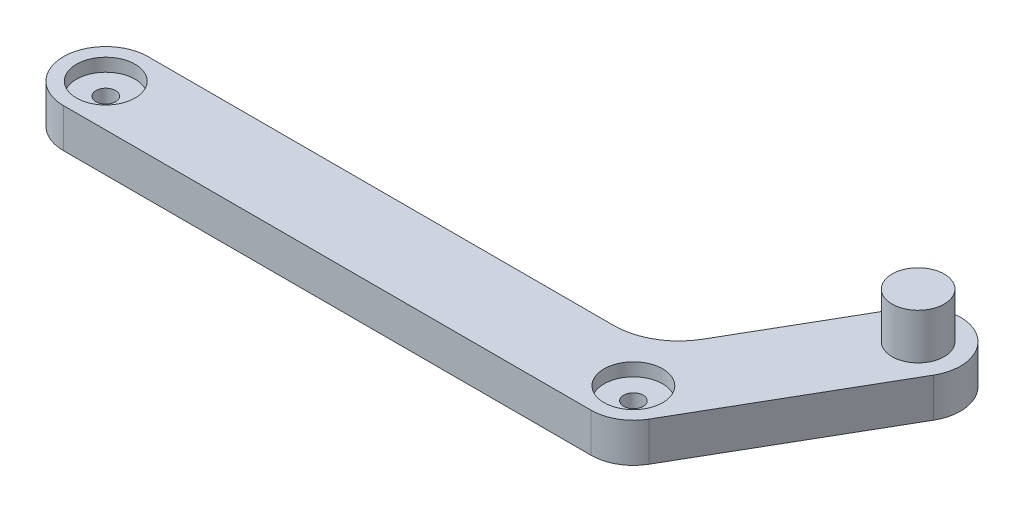
ISO-10303-21;
HEADER;
FILE_DESCRIPTION(('STEP AP214'),'2;1');
FILE_NAME('part.step','',(''),(''),'','','');
FILE_SCHEMA(('AUTOMOTIVE_DESIGN { 1 0 10303 214 1 1 1 1 }'));
ENDSEC;
DATA;
#1=APPLICATION_CONTEXT('core data for automotive mechanical design processes');
#2=APPLICATION_PROTOCOL_DEFINITION('international standard','automotive_design',2000,#1);
#3=PRODUCT_CONTEXT('',#1,'mechanical');
#4=PRODUCT('Part','Part','',(#3));
#5=PRODUCT_RELATED_PRODUCT_CATEGORY('part','',(#4));
#6=PRODUCT_DEFINITION_FORMATION('','',#4);
#7=PRODUCT_DEFINITION_CONTEXT('part definition',#1,'design');
#8=PRODUCT_DEFINITION('design','',#6,#7);
#9=PRODUCT_DEFINITION_SHAPE('','',#8);
#10=(LENGTH_UNIT() NAMED_UNIT(*) SI_UNIT(.MILLI.,.METRE.));
#11=(NAMED_UNIT(*) PLANE_ANGLE_UNIT() SI_UNIT($,.RADIAN.));
#12=(NAMED_UNIT(*) SI_UNIT($,.STERADIAN.) SOLID_ANGLE_UNIT());
#13=UNCERTAINTY_MEASURE_WITH_UNIT(LENGTH_MEASURE(1.E-05),#10,'distance_accuracy_value','');
#14=(GEOMETRIC_REPRESENTATION_CONTEXT(3) GLOBAL_UNCERTAINTY_ASSIGNED_CONTEXT((#13)) GLOBAL_UNIT_ASSIGNED_CONTEXT((#10,
#11,#12)) REPRESENTATION_CONTEXT('',''));
#15=CARTESIAN_POINT('',(0.,0.,0.));
#16=DIRECTION('',(0.,0.,1.));
#17=DIRECTION('',(1.,0.,0.));
#18=AXIS2_PLACEMENT_3D('',#15,#16,#17);
#19=CARTESIAN_POINT('',(0.,6.,0.));
#20=DIRECTION('',(0.,-1.,0.));
#21=DIRECTION('',(0.,0.,-1.));
#22=AXIS2_PLACEMENT_3D('',#19,#20,#21);
#23=CYLINDRICAL_SURFACE('',#22,1.5);
#24=CARTESIAN_POINT('',(0.,0.,0.));
#25=DIRECTION('',(0.,1.,0.));
#26=DIRECTION('',(0.,0.,1.));
#27=AXIS2_PLACEMENT_3D('',#24,#25,#26);
#28=CIRCLE('',#27,1.5);
#29=CARTESIAN_POINT('',(0.,0.,1.5));
#30=VERTEX_POINT('',#29);
#31=EDGE_CURVE('E152',#30,#30,#28,.T.);
#32=ORIENTED_EDGE('',*,*,#31,.F.);
#33=EDGE_LOOP('',(#32));
#34=FACE_BOUND('',#33,.T.);
#35=CARTESIAN_POINT('',(0.,4.,0.));
#36=DIRECTION('',(0.,1.,0.));
#37=DIRECTION('',(0.,0.,1.));
#38=AXIS2_PLACEMENT_3D('',#35,#36,#37);
#39=CIRCLE('',#38,1.5);
#40=CARTESIAN_POINT('',(0.,4.,1.5));
#41=VERTEX_POINT('',#40);
#42=EDGE_CURVE('E47',#41,#41,#39,.T.);
#43=ORIENTED_EDGE('',*,*,#42,.T.);
#44=EDGE_LOOP('',(#43));
#45=FACE_BOUND('',#44,.T.);
#46=ADVANCED_FACE('F43',(#34,#45),#23,.F.);
#47=CARTESIAN_POINT('',(81.,6.,0.));
#48=DIRECTION('',(0.,-1.,0.));
#49=DIRECTION('',(0.,0.,-1.));
#50=AXIS2_PLACEMENT_3D('',#47,#48,#49);
#51=CYLINDRICAL_SURFACE('',#50,1.5);
#52=CARTESIAN_POINT('',(81.,0.,0.));
#53=DIRECTION('',(0.,1.,0.));
#54=DIRECTION('',(0.,0.,1.));
#55=AXIS2_PLACEMENT_3D('',#52,#53,#54);
#56=CIRCLE('',#55,1.5);
#57=CARTESIAN_POINT('',(81.,0.,1.5));
#58=VERTEX_POINT('',#57);
#59=EDGE_CURVE('E196',#58,#58,#56,.T.);
#60=ORIENTED_EDGE('',*,*,#59,.F.);
#61=EDGE_LOOP('',(#60));
#62=FACE_BOUND('',#61,.T.);
#63=CARTESIAN_POINT('',(81.,4.,0.));
#64=DIRECTION('',(0.,1.,0.));
#65=DIRECTION('',(0.,0.,1.));
#66=AXIS2_PLACEMENT_3D('',#63,#64,#65);
#67=CIRCLE('',#66,1.5);
#68=CARTESIAN_POINT('',(81.,4.,1.5));
#69=VERTEX_POINT('',#68);
#70=EDGE_CURVE('E187',#69,#69,#67,.T.);
#71=ORIENTED_EDGE('',*,*,#70,.T.);
#72=EDGE_LOOP('',(#71));
#73=FACE_BOUND('',#72,.T.);
#74=ADVANCED_FACE('F266',(#62,#73),#51,.F.);
#75=CARTESIAN_POINT('',(0.,6.,0.));
#76=DIRECTION('',(0.,1.,0.));
#77=DIRECTION('',(0.,0.,1.));
#78=AXIS2_PLACEMENT_3D('',#75,#76,#77);
#79=PLANE('',#78);
#80=CARTESIAN_POINT('',(96.9999999999999,6.,-27.7128129211021));
#81=DIRECTION('',(0.,1.,0.));
#82=DIRECTION('',(0.,0.,1.));
#83=AXIS2_PLACEMENT_3D('',#80,#81,#82);
#84=CIRCLE('',#83,4.00000000000001);
#85=CARTESIAN_POINT('',(96.9999999999999,6.,-23.7128129211021));
#86=VERTEX_POINT('',#85);
#87=EDGE_CURVE('E207',#86,#86,#84,.T.);
#88=ORIENTED_EDGE('',*,*,#87,.F.);
#89=EDGE_LOOP('',(#88));
#90=FACE_BOUND('',#89,.T.);
#91=CARTESIAN_POINT('',(81.,6.,0.));
#92=DIRECTION('',(0.,1.,0.));
#93=DIRECTION('',(0.,0.,1.));
#94=AXIS2_PLACEMENT_3D('',#91,#92,#93);
#95=CIRCLE('',#94,4.49999999999999);
#96=CARTESIAN_POINT('',(81.,6.,4.49999999999999));
#97=VERTEX_POINT('',#96);
#98=EDGE_CURVE('E198',#97,#97,#95,.T.);
#99=ORIENTED_EDGE('',*,*,#98,.F.);
#100=EDGE_LOOP('',(#99));
#101=FACE_BOUND('',#100,.T.);
#102=CARTESIAN_POINT('',(0.,6.,0.));
#103=DIRECTION('',(0.,1.,0.));
#104=DIRECTION('',(0.,0.,1.));
#105=AXIS2_PLACEMENT_3D('',#102,#103,#104);
#106=CIRCLE('',#105,4.5);
#107=CARTESIAN_POINT('',(0.,6.,4.5));
#108=VERTEX_POINT('',#107);
#109=EDGE_CURVE('E204',#108,#108,#106,.T.);
#110=ORIENTED_EDGE('',*,*,#109,.F.);
#111=EDGE_LOOP('',(#110));
#112=FACE_BOUND('',#111,.T.);
#113=CARTESIAN_POINT('',(0.,6.,0.));
#114=DIRECTION('',(0.,1.,0.));
#115=DIRECTION('',(0.,0.,1.));
#116=AXIS2_PLACEMENT_3D('',#113,#114,#115);
#117=CIRCLE('',#116,6.5);
#118=CARTESIAN_POINT('',(0.,6.,-6.5));
#119=VERTEX_POINT('',#118);
#120=CARTESIAN_POINT('',(0.,6.,6.5));
#121=VERTEX_POINT('',#120);
#122=EDGE_CURVE('E170',#119,#121,#117,.T.);
#123=ORIENTED_EDGE('',*,*,#122,.T.);
#124=DIRECTION('',(1.,0.,0.));
#125=VECTOR('',#124,1.);
#126=CARTESIAN_POINT('',(0.,6.,6.5));
#127=LINE('',#126,#125);
#128=CARTESIAN_POINT('',(81.,6.,6.50000000000001));
#129=VERTEX_POINT('',#128);
#130=EDGE_CURVE('E106',#121,#129,#127,.T.);
#131=ORIENTED_EDGE('',*,*,#130,.T.);
#132=CARTESIAN_POINT('',(81.,6.,0.));
#133=DIRECTION('',(0.,1.,0.));
#134=DIRECTION('',(0.,0.,1.));
#135=AXIS2_PLACEMENT_3D('',#132,#133,#134);
#136=CIRCLE('',#135,6.50000000000001);
#137=CARTESIAN_POINT('',(86.6291651245989,6.,3.25));
#138=VERTEX_POINT('',#137);
#139=EDGE_CURVE('E228',#129,#138,#136,.T.);
#140=ORIENTED_EDGE('',*,*,#139,.T.);
#141=DIRECTION('',(0.499999999999998,0.,-0.86602540378444));
#142=VECTOR('',#141,1.);
#143=CARTESIAN_POINT('',(86.6291651245989,6.,3.25));
#144=LINE('',#143,#142);
#145=CARTESIAN_POINT('',(102.629165124599,6.,-24.4628129211021));
#146=VERTEX_POINT('',#145);
#147=EDGE_CURVE('E231',#138,#146,#144,.T.);
#148=ORIENTED_EDGE('',*,*,#147,.T.);
#149=CARTESIAN_POINT('',(96.9999999999999,6.,-27.7128129211021));
#150=DIRECTION('',(0.,1.,0.));
#151=DIRECTION('',(0.,0.,1.));
#152=AXIS2_PLACEMENT_3D('',#149,#150,#151);
#153=CIRCLE('',#152,6.50000000000001);
#154=CARTESIAN_POINT('',(91.3708348754011,6.,-30.9628129211021));
#155=VERTEX_POINT('',#154);
#156=EDGE_CURVE('E125',#146,#155,#153,.T.);
#157=ORIENTED_EDGE('',*,*,#156,.T.);
#158=DIRECTION('',(-0.499999999999997,0.,0.866025403784441));
#159=VECTOR('',#158,1.);
#160=CARTESIAN_POINT('',(80.1339745962156,6.,-11.5));
#161=LINE('',#160,#159);
#162=CARTESIAN_POINT('',(80.1339745962156,6.,-11.5));
#163=VERTEX_POINT('',#162);
#164=EDGE_CURVE('E119',#155,#163,#161,.T.);
#165=ORIENTED_EDGE('',*,*,#164,.T.);
#166=CARTESIAN_POINT('',(71.4737205583711,6.,-16.5));
#167=DIRECTION('',(0.,-1.,0.));
#168=DIRECTION('',(0.,0.,-1.));
#169=AXIS2_PLACEMENT_3D('',#166,#167,#168);
#170=CIRCLE('',#169,10.);
#171=CARTESIAN_POINT('',(71.4737205583711,6.,-6.5));
#172=VERTEX_POINT('',#171);
#173=EDGE_CURVE('E123',#163,#172,#170,.T.);
#174=ORIENTED_EDGE('',*,*,#173,.T.);
#175=DIRECTION('',(-1.,0.,0.));
#176=VECTOR('',#175,1.);
#177=CARTESIAN_POINT('',(0.,6.,-6.5));
#178=LINE('',#177,#176);
#179=EDGE_CURVE('E63',#172,#119,#178,.T.);
#180=ORIENTED_EDGE('',*,*,#179,.T.);
#181=EDGE_LOOP('',(#123,#131,#140,#148,#157,#165,#174,#180));
#182=FACE_BOUND('',#181,.T.);
#183=ADVANCED_FACE('F121',(#90,#101,#112,#182),#79,.T.);
#184=CARTESIAN_POINT('',(0.,0.,0.));
#185=DIRECTION('',(0.,1.,0.));
#186=DIRECTION('',(0.,0.,1.));
#187=AXIS2_PLACEMENT_3D('',#184,#185,#186);
#188=PLANE('',#187);
#189=CARTESIAN_POINT('',(0.,0.,0.));
#190=DIRECTION('',(0.,1.,0.));
#191=DIRECTION('',(0.,0.,1.));
#192=AXIS2_PLACEMENT_3D('',#189,#190,#191);
#193=CIRCLE('',#192,6.5);
#194=CARTESIAN_POINT('',(0.,0.,-6.5));
#195=VERTEX_POINT('',#194);
#196=CARTESIAN_POINT('',(0.,0.,6.5));
#197=VERTEX_POINT('',#196);
#198=EDGE_CURVE('E147',#195,#197,#193,.T.);
#199=ORIENTED_EDGE('',*,*,#198,.F.);
#200=DIRECTION('',(-1.,0.,0.));
#201=VECTOR('',#200,1.);
#202=CARTESIAN_POINT('',(0.,0.,-6.5));
#203=LINE('',#202,#201);
#204=CARTESIAN_POINT('',(71.4737205583711,0.,-6.5));
#205=VERTEX_POINT('',#204);
#206=EDGE_CURVE('E98',#205,#195,#203,.T.);
#207=ORIENTED_EDGE('',*,*,#206,.F.);
#208=CARTESIAN_POINT('',(71.4737205583711,0.,-16.5));
#209=DIRECTION('',(0.,-1.,0.));
#210=DIRECTION('',(0.,0.,-1.));
#211=AXIS2_PLACEMENT_3D('',#208,#209,#210);
#212=CIRCLE('',#211,10.);
#213=CARTESIAN_POINT('',(80.1339745962156,0.,-11.5));
#214=VERTEX_POINT('',#213);
#215=EDGE_CURVE('E92',#214,#205,#212,.T.);
#216=ORIENTED_EDGE('',*,*,#215,.F.);
#217=DIRECTION('',(-0.499999999999997,0.,0.866025403784441));
#218=VECTOR('',#217,1.);
#219=CARTESIAN_POINT('',(80.1339745962156,0.,-11.5));
#220=LINE('',#219,#218);
#221=CARTESIAN_POINT('',(91.3708348754011,0.,-30.9628129211021));
#222=VERTEX_POINT('',#221);
#223=EDGE_CURVE('E134',#222,#214,#220,.T.);
#224=ORIENTED_EDGE('',*,*,#223,.F.);
#225=CARTESIAN_POINT('',(96.9999999999999,0.,-27.7128129211021));
#226=DIRECTION('',(0.,1.,0.));
#227=DIRECTION('',(0.,0.,1.));
#228=AXIS2_PLACEMENT_3D('',#225,#226,#227);
#229=CIRCLE('',#228,6.50000000000001);
#230=CARTESIAN_POINT('',(102.629165124599,0.,-24.4628129211021));
#231=VERTEX_POINT('',#230);
#232=EDGE_CURVE('E161',#231,#222,#229,.T.);
#233=ORIENTED_EDGE('',*,*,#232,.F.);
#234=DIRECTION('',(0.499999999999998,0.,-0.86602540378444));
#235=VECTOR('',#234,1.);
#236=CARTESIAN_POINT('',(86.6291651245989,0.,3.25));
#237=LINE('',#236,#235);
#238=CARTESIAN_POINT('',(86.6291651245989,0.,3.25));
#239=VERTEX_POINT('',#238);
#240=EDGE_CURVE('E158',#239,#231,#237,.T.);
#241=ORIENTED_EDGE('',*,*,#240,.F.);
#242=CARTESIAN_POINT('',(81.,0.,0.));
#243=DIRECTION('',(0.,1.,0.));
#244=DIRECTION('',(0.,0.,1.));
#245=AXIS2_PLACEMENT_3D('',#242,#243,#244);
#246=CIRCLE('',#245,6.50000000000001);
#247=CARTESIAN_POINT('',(81.,0.,6.50000000000001));
#248=VERTEX_POINT('',#247);
#249=EDGE_CURVE('E155',#248,#239,#246,.T.);
#250=ORIENTED_EDGE('',*,*,#249,.F.);
#251=DIRECTION('',(1.,0.,0.));
#252=VECTOR('',#251,1.);
#253=CARTESIAN_POINT('',(0.,0.,6.5));
#254=LINE('',#253,#252);
#255=EDGE_CURVE('E151',#197,#248,#254,.T.);
#256=ORIENTED_EDGE('',*,*,#255,.F.);
#257=EDGE_LOOP('',(#199,#207,#216,#224,#233,#241,#250,#256));
#258=FACE_BOUND('',#257,.T.);
#259=ORIENTED_EDGE('',*,*,#31,.T.);
#260=EDGE_LOOP('',(#259));
#261=FACE_BOUND('',#260,.T.);
#262=ORIENTED_EDGE('',*,*,#59,.T.);
#263=EDGE_LOOP('',(#262));
#264=FACE_BOUND('',#263,.T.);
#265=ADVANCED_FACE('F246',(#258,#261,#264),#188,.F.);
#266=CARTESIAN_POINT('',(0.,6.,0.));
#267=DIRECTION('',(0.,-1.,0.));
#268=DIRECTION('',(0.,0.,-1.));
#269=AXIS2_PLACEMENT_3D('',#266,#267,#268);
#270=CYLINDRICAL_SURFACE('',#269,6.5);
#271=ORIENTED_EDGE('',*,*,#198,.T.);
#272=DIRECTION('',(0.,-1.,0.));
#273=VECTOR('',#272,1.);
#274=CARTESIAN_POINT('',(0.,6.,6.5));
#275=LINE('',#274,#273);
#276=EDGE_CURVE('E11',#121,#197,#275,.T.);
#277=ORIENTED_EDGE('',*,*,#276,.F.);
#278=ORIENTED_EDGE('',*,*,#122,.F.);
#279=DIRECTION('',(0.,-1.,0.));
#280=VECTOR('',#279,1.);
#281=CARTESIAN_POINT('',(0.,6.,-6.5));
#282=LINE('',#281,#280);
#283=EDGE_CURVE('E143',#119,#195,#282,.T.);
#284=ORIENTED_EDGE('',*,*,#283,.T.);
#285=EDGE_LOOP('',(#271,#277,#278,#284));
#286=FACE_BOUND('',#285,.T.);
#287=ADVANCED_FACE('F45',(#286),#270,.T.);
#288=CARTESIAN_POINT('',(0.,6.,6.5));
#289=DIRECTION('',(0.,0.,-1.));
#290=DIRECTION('',(-1.,0.,0.));
#291=AXIS2_PLACEMENT_3D('',#288,#289,#290);
#292=PLANE('',#291);
#293=ORIENTED_EDGE('',*,*,#255,.T.);
#294=DIRECTION('',(0.,-1.,0.));
#295=VECTOR('',#294,1.);
#296=CARTESIAN_POINT('',(81.,6.,6.50000000000001));
#297=LINE('',#296,#295);
#298=EDGE_CURVE('E54',#129,#248,#297,.T.);
#299=ORIENTED_EDGE('',*,*,#298,.F.);
#300=ORIENTED_EDGE('',*,*,#130,.F.);
#301=ORIENTED_EDGE('',*,*,#276,.T.);
#302=EDGE_LOOP('',(#293,#299,#300,#301));
#303=FACE_BOUND('',#302,.T.);
#304=ADVANCED_FACE('F284',(#303),#292,.F.);
#305=CARTESIAN_POINT('',(81.,6.,0.));
#306=DIRECTION('',(0.,-1.,0.));
#307=DIRECTION('',(0.,0.,-1.));
#308=AXIS2_PLACEMENT_3D('',#305,#306,#307);
#309=CYLINDRICAL_SURFACE('',#308,6.50000000000001);
#310=ORIENTED_EDGE('',*,*,#249,.T.);
#311=DIRECTION('',(0.,-1.,0.));
#312=VECTOR('',#311,1.);
#313=CARTESIAN_POINT('',(86.6291651245989,6.,3.25));
#314=LINE('',#313,#312);
#315=EDGE_CURVE('E181',#138,#239,#314,.T.);
#316=ORIENTED_EDGE('',*,*,#315,.F.);
#317=ORIENTED_EDGE('',*,*,#139,.F.);
#318=ORIENTED_EDGE('',*,*,#298,.T.);
#319=EDGE_LOOP('',(#310,#316,#317,#318));
#320=FACE_BOUND('',#319,.T.);
#321=ADVANCED_FACE('F288',(#320),#309,.T.);
#322=CARTESIAN_POINT('',(86.6291651245989,6.,3.25));
#323=DIRECTION('',(-0.86602540378444,0.,-0.499999999999998));
#324=DIRECTION('',(-0.499999999999998,0.,0.86602540378444));
#325=AXIS2_PLACEMENT_3D('',#322,#323,#324);
#326=PLANE('',#325);
#327=ORIENTED_EDGE('',*,*,#240,.T.);
#328=DIRECTION('',(0.,-1.,0.));
#329=VECTOR('',#328,1.);
#330=CARTESIAN_POINT('',(102.629165124599,6.,-24.4628129211021));
#331=LINE('',#330,#329);
#332=EDGE_CURVE('E177',#146,#231,#331,.T.);
#333=ORIENTED_EDGE('',*,*,#332,.F.);
#334=ORIENTED_EDGE('',*,*,#147,.F.);
#335=ORIENTED_EDGE('',*,*,#315,.T.);
#336=EDGE_LOOP('',(#327,#333,#334,#335));
#337=FACE_BOUND('',#336,.T.);
#338=ADVANCED_FACE('F239',(#337),#326,.F.);
#339=CARTESIAN_POINT('',(96.9999999999999,6.,-27.7128129211021));
#340=DIRECTION('',(0.,-1.,0.));
#341=DIRECTION('',(0.,0.,-1.));
#342=AXIS2_PLACEMENT_3D('',#339,#340,#341);
#343=CYLINDRICAL_SURFACE('',#342,6.50000000000001);
#344=ORIENTED_EDGE('',*,*,#232,.T.);
#345=DIRECTION('',(0.,-1.,0.));
#346=VECTOR('',#345,1.);
#347=CARTESIAN_POINT('',(91.3708348754011,6.,-30.9628129211021));
#348=LINE('',#347,#346);
#349=EDGE_CURVE('E136',#155,#222,#348,.T.);
#350=ORIENTED_EDGE('',*,*,#349,.F.);
#351=ORIENTED_EDGE('',*,*,#156,.F.);
#352=ORIENTED_EDGE('',*,*,#332,.T.);
#353=EDGE_LOOP('',(#344,#350,#351,#352));
#354=FACE_BOUND('',#353,.T.);
#355=ADVANCED_FACE('F243',(#354),#343,.T.);
#356=CARTESIAN_POINT('',(80.1339745962156,6.,-11.5));
#357=DIRECTION('',(0.866025403784441,0.,0.499999999999996));
#358=DIRECTION('',(0.499999999999997,0.,-0.866025403784441));
#359=AXIS2_PLACEMENT_3D('',#356,#357,#358);
#360=PLANE('',#359);
#361=ORIENTED_EDGE('',*,*,#223,.T.);
#362=DIRECTION('',(0.,-1.,0.));
#363=VECTOR('',#362,1.);
#364=CARTESIAN_POINT('',(80.1339745962156,6.,-11.5));
#365=LINE('',#364,#363);
#366=EDGE_CURVE('E131',#163,#214,#365,.T.);
#367=ORIENTED_EDGE('',*,*,#366,.F.);
#368=ORIENTED_EDGE('',*,*,#164,.F.);
#369=ORIENTED_EDGE('',*,*,#349,.T.);
#370=EDGE_LOOP('',(#361,#367,#368,#369));
#371=FACE_BOUND('',#370,.T.);
#372=ADVANCED_FACE('F132',(#371),#360,.F.);
#373=CARTESIAN_POINT('',(71.4737205583711,6.,-16.5));
#374=DIRECTION('',(0.,-1.,0.));
#375=DIRECTION('',(0.,0.,-1.));
#376=AXIS2_PLACEMENT_3D('',#373,#374,#375);
#377=CYLINDRICAL_SURFACE('',#376,10.);
#378=ORIENTED_EDGE('',*,*,#215,.T.);
#379=DIRECTION('',(0.,-1.,0.));
#380=VECTOR('',#379,1.);
#381=CARTESIAN_POINT('',(71.4737205583711,6.,-6.5));
#382=LINE('',#381,#380);
#383=EDGE_CURVE('E137',#172,#205,#382,.T.);
#384=ORIENTED_EDGE('',*,*,#383,.F.);
#385=ORIENTED_EDGE('',*,*,#173,.F.);
#386=ORIENTED_EDGE('',*,*,#366,.T.);
#387=EDGE_LOOP('',(#378,#384,#385,#386));
#388=FACE_BOUND('',#387,.T.);
#389=ADVANCED_FACE('F139',(#388),#377,.F.);
#390=CARTESIAN_POINT('',(0.,6.,-6.5));
#391=DIRECTION('',(0.,0.,1.));
#392=DIRECTION('',(1.,0.,0.));
#393=AXIS2_PLACEMENT_3D('',#390,#391,#392);
#394=PLANE('',#393);
#395=ORIENTED_EDGE('',*,*,#206,.T.);
#396=ORIENTED_EDGE('',*,*,#283,.F.);
#397=ORIENTED_EDGE('',*,*,#179,.F.);
#398=ORIENTED_EDGE('',*,*,#383,.T.);
#399=EDGE_LOOP('',(#395,#396,#397,#398));
#400=FACE_BOUND('',#399,.T.);
#401=ADVANCED_FACE('F252',(#400),#394,.F.);
#402=CARTESIAN_POINT('',(81.,4.,0.));
#403=DIRECTION('',(0.,1.,0.));
#404=DIRECTION('',(0.,0.,1.));
#405=AXIS2_PLACEMENT_3D('',#402,#403,#404);
#406=CYLINDRICAL_SURFACE('',#405,4.49999999999999);
#407=CARTESIAN_POINT('',(81.,4.,0.));
#408=DIRECTION('',(0.,1.,0.));
#409=DIRECTION('',(0.,0.,1.));
#410=AXIS2_PLACEMENT_3D('',#407,#408,#409);
#411=CIRCLE('',#410,4.49999999999999);
#412=CARTESIAN_POINT('',(81.,4.,4.49999999999999));
#413=VERTEX_POINT('',#412);
#414=EDGE_CURVE('E190',#413,#413,#411,.T.);
#415=ORIENTED_EDGE('',*,*,#414,.F.);
#416=EDGE_LOOP('',(#415));
#417=FACE_BOUND('',#416,.T.);
#418=ORIENTED_EDGE('',*,*,#98,.T.);
#419=EDGE_LOOP('',(#418));
#420=FACE_BOUND('',#419,.T.);
#421=ADVANCED_FACE('F254',(#417,#420),#406,.F.);
#422=CARTESIAN_POINT('',(81.,4.,0.));
#423=DIRECTION('',(0.,1.,0.));
#424=DIRECTION('',(0.,0.,1.));
#425=AXIS2_PLACEMENT_3D('',#422,#423,#424);
#426=PLANE('',#425);
#427=ORIENTED_EDGE('',*,*,#70,.F.);
#428=EDGE_LOOP('',(#427));
#429=FACE_BOUND('',#428,.T.);
#430=ORIENTED_EDGE('',*,*,#414,.T.);
#431=EDGE_LOOP('',(#430));
#432=FACE_BOUND('',#431,.T.);
#433=ADVANCED_FACE('F260',(#429,#432),#426,.T.);
#434=CARTESIAN_POINT('',(0.,4.,0.));
#435=DIRECTION('',(0.,1.,0.));
#436=DIRECTION('',(0.,0.,1.));
#437=AXIS2_PLACEMENT_3D('',#434,#435,#436);
#438=CYLINDRICAL_SURFACE('',#437,4.5);
#439=CARTESIAN_POINT('',(0.,4.,0.));
#440=DIRECTION('',(0.,1.,0.));
#441=DIRECTION('',(0.,0.,1.));
#442=AXIS2_PLACEMENT_3D('',#439,#440,#441);
#443=CIRCLE('',#442,4.5);
#444=CARTESIAN_POINT('',(0.,4.,4.5));
#445=VERTEX_POINT('',#444);
#446=EDGE_CURVE('E213',#445,#445,#443,.T.);
#447=ORIENTED_EDGE('',*,*,#446,.F.);
#448=EDGE_LOOP('',(#447));
#449=FACE_BOUND('',#448,.T.);
#450=ORIENTED_EDGE('',*,*,#109,.T.);
#451=EDGE_LOOP('',(#450));
#452=FACE_BOUND('',#451,.T.);
#453=ADVANCED_FACE('F340',(#449,#452),#438,.F.);
#454=CARTESIAN_POINT('',(0.,4.,0.));
#455=DIRECTION('',(0.,1.,0.));
#456=DIRECTION('',(0.,0.,1.));
#457=AXIS2_PLACEMENT_3D('',#454,#455,#456);
#458=PLANE('',#457);
#459=ORIENTED_EDGE('',*,*,#42,.F.);
#460=EDGE_LOOP('',(#459));
#461=FACE_BOUND('',#460,.T.);
#462=ORIENTED_EDGE('',*,*,#446,.T.);
#463=EDGE_LOOP('',(#462));
#464=FACE_BOUND('',#463,.T.);
#465=ADVANCED_FACE('F351',(#461,#464),#458,.T.);
#466=CARTESIAN_POINT('',(96.9999999999999,13.,-27.7128129211021));
#467=DIRECTION('',(0.,-1.,0.));
#468=DIRECTION('',(0.,0.,-1.));
#469=AXIS2_PLACEMENT_3D('',#466,#467,#468);
#470=CYLINDRICAL_SURFACE('',#469,4.00000000000001);
#471=CARTESIAN_POINT('',(96.9999999999999,13.,-27.7128129211021));
#472=DIRECTION('',(0.,1.,0.));
#473=DIRECTION('',(0.,0.,1.));
#474=AXIS2_PLACEMENT_3D('',#471,#472,#473);
#475=CIRCLE('',#474,4.00000000000001);
#476=CARTESIAN_POINT('',(96.9999999999999,13.,-23.7128129211021));
#477=VERTEX_POINT('',#476);
#478=EDGE_CURVE('E217',#477,#477,#475,.T.);
#479=ORIENTED_EDGE('',*,*,#478,.F.);
#480=EDGE_LOOP('',(#479));
#481=FACE_BOUND('',#480,.T.);
#482=ORIENTED_EDGE('',*,*,#87,.T.);
#483=EDGE_LOOP('',(#482));
#484=FACE_BOUND('',#483,.T.);
#485=ADVANCED_FACE('F362',(#481,#484),#470,.T.);
#486=CARTESIAN_POINT('',(96.9999999999999,13.,-27.7128129211021));
#487=DIRECTION('',(0.,1.,0.));
#488=DIRECTION('',(0.,0.,1.));
#489=AXIS2_PLACEMENT_3D('',#486,#487,#488);
#490=PLANE('',#489);
#491=ORIENTED_EDGE('',*,*,#478,.T.);
#492=EDGE_LOOP('',(#491));
#493=FACE_BOUND('',#492,.T.);
#494=ADVANCED_FACE('F380',(#493),#490,.T.);
#495=CLOSED_SHELL('',(#46,#74,#183,#265,#287,#304,#321,#338,#355,#372,#389,#401,#421,#433,#453,
#465,#485,#494));
#496=MANIFOLD_SOLID_BREP('B2',#495);
#497=ADVANCED_BREP_SHAPE_REPRESENTATION('',(#18,#496),#14);
#498=SHAPE_DEFINITION_REPRESENTATION(#9,#497);
ENDSEC;
END-ISO-10303-21;
